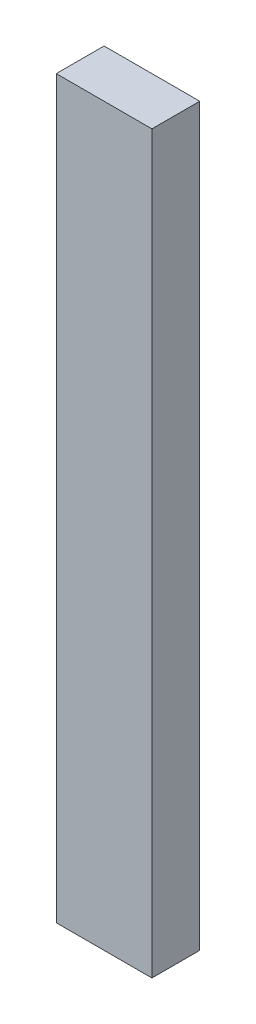
ISO-10303-21;
HEADER;
FILE_DESCRIPTION(('STEP AP214'),'2;1');
FILE_NAME('part.step','',(''),(''),'','','');
FILE_SCHEMA(('AUTOMOTIVE_DESIGN { 1 0 10303 214 1 1 1 1 }'));
ENDSEC;
DATA;
#1=APPLICATION_CONTEXT('core data for automotive mechanical design processes');
#2=APPLICATION_PROTOCOL_DEFINITION('international standard','automotive_design',2000,#1);
#3=PRODUCT_CONTEXT('',#1,'mechanical');
#4=PRODUCT('Part','Part','',(#3));
#5=PRODUCT_RELATED_PRODUCT_CATEGORY('part','',(#4));
#6=PRODUCT_DEFINITION_FORMATION('','',#4);
#7=PRODUCT_DEFINITION_CONTEXT('part definition',#1,'design');
#8=PRODUCT_DEFINITION('design','',#6,#7);
#9=PRODUCT_DEFINITION_SHAPE('','',#8);
#10=(LENGTH_UNIT() NAMED_UNIT(*) SI_UNIT(.MILLI.,.METRE.));
#11=(NAMED_UNIT(*) PLANE_ANGLE_UNIT() SI_UNIT($,.RADIAN.));
#12=(NAMED_UNIT(*) SI_UNIT($,.STERADIAN.) SOLID_ANGLE_UNIT());
#13=UNCERTAINTY_MEASURE_WITH_UNIT(LENGTH_MEASURE(1.E-05),#10,'distance_accuracy_value','');
#14=(GEOMETRIC_REPRESENTATION_CONTEXT(3) GLOBAL_UNCERTAINTY_ASSIGNED_CONTEXT((#13)) GLOBAL_UNIT_ASSIGNED_CONTEXT((#10,
#11,#12)) REPRESENTATION_CONTEXT('',''));
#15=CARTESIAN_POINT('',(0.,0.,0.));
#16=DIRECTION('',(0.,0.,1.));
#17=DIRECTION('',(1.,0.,0.));
#18=AXIS2_PLACEMENT_3D('',#15,#16,#17);
#19=CARTESIAN_POINT('',(0.,195.2625,0.));
#20=DIRECTION('',(1.,0.,0.));
#21=DIRECTION('',(0.,0.,-1.));
#22=AXIS2_PLACEMENT_3D('',#19,#20,#21);
#23=PLANE('',#22);
#24=DIRECTION('',(0.,0.,1.));
#25=VECTOR('',#24,1.);
#26=CARTESIAN_POINT('',(0.,0.,0.));
#27=LINE('',#26,#25);
#28=CARTESIAN_POINT('',(0.,0.,-12.7));
#29=VERTEX_POINT('',#28);
#30=CARTESIAN_POINT('',(0.,0.,0.));
#31=VERTEX_POINT('',#30);
#32=EDGE_CURVE('E97',#29,#31,#27,.T.);
#33=ORIENTED_EDGE('',*,*,#32,.T.);
#34=DIRECTION('',(0.,-1.,0.));
#35=VECTOR('',#34,1.);
#36=CARTESIAN_POINT('',(0.,195.2625,0.));
#37=LINE('',#36,#35);
#38=CARTESIAN_POINT('',(0.,195.2625,0.));
#39=VERTEX_POINT('',#38);
#40=EDGE_CURVE('E11',#39,#31,#37,.T.);
#41=ORIENTED_EDGE('',*,*,#40,.F.);
#42=DIRECTION('',(0.,0.,1.));
#43=VECTOR('',#42,1.);
#44=CARTESIAN_POINT('',(0.,195.2625,0.));
#45=LINE('',#44,#43);
#46=CARTESIAN_POINT('',(0.,195.2625,-12.7));
#47=VERTEX_POINT('',#46);
#48=EDGE_CURVE('E85',#47,#39,#45,.T.);
#49=ORIENTED_EDGE('',*,*,#48,.F.);
#50=DIRECTION('',(0.,-1.,0.));
#51=VECTOR('',#50,1.);
#52=CARTESIAN_POINT('',(0.,195.2625,-12.7));
#53=LINE('',#52,#51);
#54=EDGE_CURVE('E93',#47,#29,#53,.T.);
#55=ORIENTED_EDGE('',*,*,#54,.T.);
#56=EDGE_LOOP('',(#33,#41,#49,#55));
#57=FACE_BOUND('',#56,.T.);
#58=ADVANCED_FACE('F34',(#57),#23,.F.);
#59=CARTESIAN_POINT('',(0.,195.2625,0.));
#60=DIRECTION('',(0.,0.,-1.));
#61=DIRECTION('',(-1.,0.,0.));
#62=AXIS2_PLACEMENT_3D('',#59,#60,#61);
#63=PLANE('',#62);
#64=DIRECTION('',(1.,0.,0.));
#65=VECTOR('',#64,1.);
#66=CARTESIAN_POINT('',(0.,0.,0.));
#67=LINE('',#66,#65);
#68=CARTESIAN_POINT('',(25.4,0.,0.));
#69=VERTEX_POINT('',#68);
#70=EDGE_CURVE('E89',#31,#69,#67,.T.);
#71=ORIENTED_EDGE('',*,*,#70,.T.);
#72=DIRECTION('',(0.,-1.,0.));
#73=VECTOR('',#72,1.);
#74=CARTESIAN_POINT('',(25.4,195.2625,0.));
#75=LINE('',#74,#73);
#76=CARTESIAN_POINT('',(25.4,195.2625,0.));
#77=VERTEX_POINT('',#76);
#78=EDGE_CURVE('E42',#77,#69,#75,.T.);
#79=ORIENTED_EDGE('',*,*,#78,.F.);
#80=DIRECTION('',(1.,0.,0.));
#81=VECTOR('',#80,1.);
#82=CARTESIAN_POINT('',(0.,195.2625,0.));
#83=LINE('',#82,#81);
#84=EDGE_CURVE('E80',#39,#77,#83,.T.);
#85=ORIENTED_EDGE('',*,*,#84,.F.);
#86=ORIENTED_EDGE('',*,*,#40,.T.);
#87=EDGE_LOOP('',(#71,#79,#85,#86));
#88=FACE_BOUND('',#87,.T.);
#89=ADVANCED_FACE('F88',(#88),#63,.F.);
#90=CARTESIAN_POINT('',(25.4,195.2625,0.));
#91=DIRECTION('',(-1.,0.,0.));
#92=DIRECTION('',(0.,0.,1.));
#93=AXIS2_PLACEMENT_3D('',#90,#91,#92);
#94=PLANE('',#93);
#95=DIRECTION('',(0.,0.,-1.));
#96=VECTOR('',#95,1.);
#97=CARTESIAN_POINT('',(25.4,0.,0.));
#98=LINE('',#97,#96);
#99=CARTESIAN_POINT('',(25.4,0.,-12.7));
#100=VERTEX_POINT('',#99);
#101=EDGE_CURVE('E67',#69,#100,#98,.T.);
#102=ORIENTED_EDGE('',*,*,#101,.T.);
#103=DIRECTION('',(0.,-1.,0.));
#104=VECTOR('',#103,1.);
#105=CARTESIAN_POINT('',(25.4,195.2625,-12.7));
#106=LINE('',#105,#104);
#107=CARTESIAN_POINT('',(25.4,195.2625,-12.7));
#108=VERTEX_POINT('',#107);
#109=EDGE_CURVE('E90',#108,#100,#106,.T.);
#110=ORIENTED_EDGE('',*,*,#109,.F.);
#111=DIRECTION('',(0.,0.,-1.));
#112=VECTOR('',#111,1.);
#113=CARTESIAN_POINT('',(25.4,195.2625,0.));
#114=LINE('',#113,#112);
#115=EDGE_CURVE('E83',#77,#108,#114,.T.);
#116=ORIENTED_EDGE('',*,*,#115,.F.);
#117=ORIENTED_EDGE('',*,*,#78,.T.);
#118=EDGE_LOOP('',(#102,#110,#116,#117));
#119=FACE_BOUND('',#118,.T.);
#120=ADVANCED_FACE('F91',(#119),#94,.F.);
#121=CARTESIAN_POINT('',(0.,195.2625,-12.7));
#122=DIRECTION('',(0.,0.,1.));
#123=DIRECTION('',(1.,0.,0.));
#124=AXIS2_PLACEMENT_3D('',#121,#122,#123);
#125=PLANE('',#124);
#126=DIRECTION('',(-1.,0.,0.));
#127=VECTOR('',#126,1.);
#128=CARTESIAN_POINT('',(0.,0.,-12.7));
#129=LINE('',#128,#127);
#130=EDGE_CURVE('E73',#100,#29,#129,.T.);
#131=ORIENTED_EDGE('',*,*,#130,.T.);
#132=ORIENTED_EDGE('',*,*,#54,.F.);
#133=DIRECTION('',(-1.,0.,0.));
#134=VECTOR('',#133,1.);
#135=CARTESIAN_POINT('',(0.,195.2625,-12.7));
#136=LINE('',#135,#134);
#137=EDGE_CURVE('E50',#108,#47,#136,.T.);
#138=ORIENTED_EDGE('',*,*,#137,.F.);
#139=ORIENTED_EDGE('',*,*,#109,.T.);
#140=EDGE_LOOP('',(#131,#132,#138,#139));
#141=FACE_BOUND('',#140,.T.);
#142=ADVANCED_FACE('F104',(#141),#125,.F.);
#143=CARTESIAN_POINT('',(0.,195.2625,0.));
#144=DIRECTION('',(0.,-1.,0.));
#145=DIRECTION('',(0.,0.,-1.));
#146=AXIS2_PLACEMENT_3D('',#143,#144,#145);
#147=PLANE('',#146);
#148=ORIENTED_EDGE('',*,*,#48,.T.);
#149=ORIENTED_EDGE('',*,*,#84,.T.);
#150=ORIENTED_EDGE('',*,*,#115,.T.);
#151=ORIENTED_EDGE('',*,*,#137,.T.);
#152=EDGE_LOOP('',(#148,#149,#150,#151));
#153=FACE_BOUND('',#152,.T.);
#154=ADVANCED_FACE('F81',(#153),#147,.F.);
#155=CARTESIAN_POINT('',(0.,0.,0.));
#156=DIRECTION('',(0.,-1.,0.));
#157=DIRECTION('',(0.,0.,-1.));
#158=AXIS2_PLACEMENT_3D('',#155,#156,#157);
#159=PLANE('',#158);
#160=ORIENTED_EDGE('',*,*,#32,.F.);
#161=ORIENTED_EDGE('',*,*,#130,.F.);
#162=ORIENTED_EDGE('',*,*,#101,.F.);
#163=ORIENTED_EDGE('',*,*,#70,.F.);
#164=EDGE_LOOP('',(#160,#161,#162,#163));
#165=FACE_BOUND('',#164,.T.);
#166=ADVANCED_FACE('F107',(#165),#159,.T.);
#167=CLOSED_SHELL('',(#58,#89,#120,#142,#154,#166));
#168=MANIFOLD_SOLID_BREP('B2',#167);
#169=ADVANCED_BREP_SHAPE_REPRESENTATION('',(#18,#168),#14);
#170=SHAPE_DEFINITION_REPRESENTATION(#9,#169);
ENDSEC;
END-ISO-10303-21;
